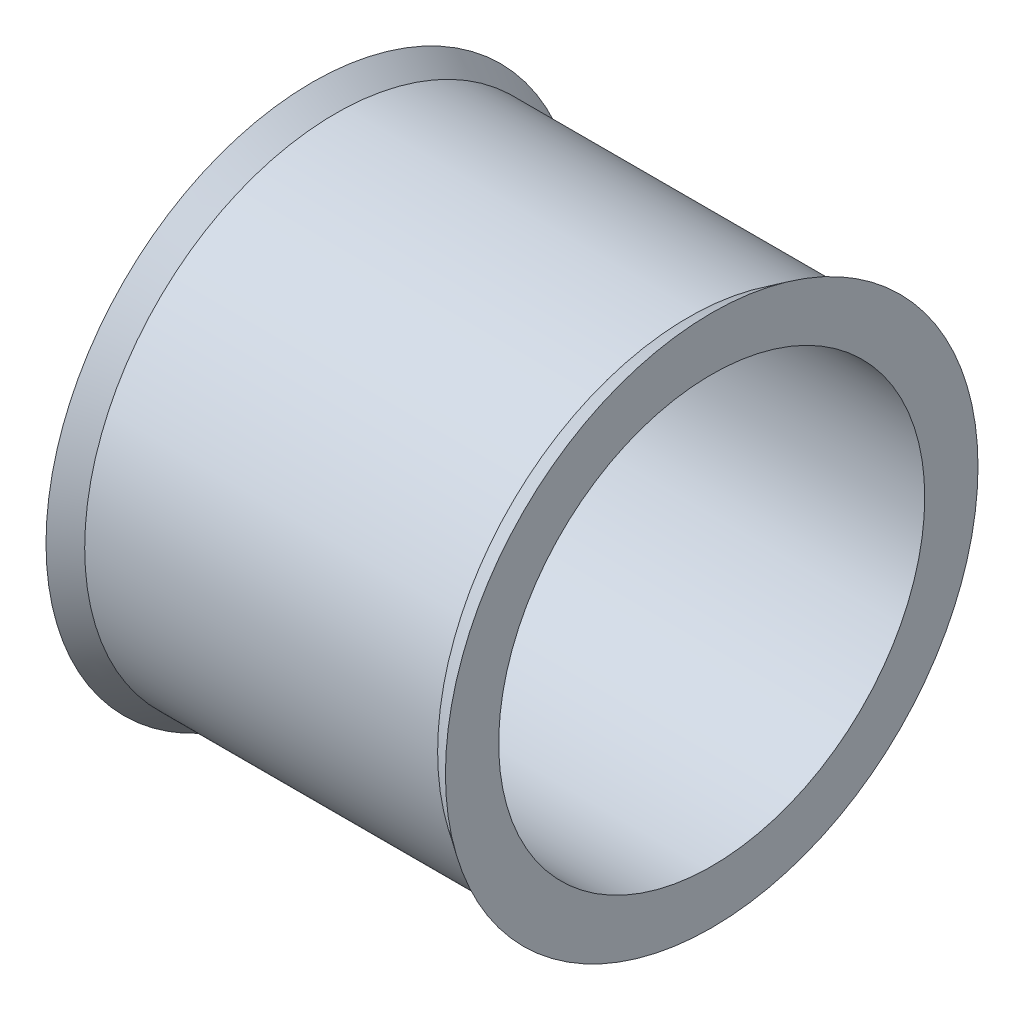
ISO-10303-21;
HEADER;
FILE_DESCRIPTION(('STEP AP214'),'2;1');
FILE_NAME('part.step','',(''),(''),'','','');
FILE_SCHEMA(('AUTOMOTIVE_DESIGN { 1 0 10303 214 1 1 1 1 }'));
ENDSEC;
DATA;
#1=APPLICATION_CONTEXT('core data for automotive mechanical design processes');
#2=APPLICATION_PROTOCOL_DEFINITION('international standard','automotive_design',2000,#1);
#3=PRODUCT_CONTEXT('',#1,'mechanical');
#4=PRODUCT('Part','Part','',(#3));
#5=PRODUCT_RELATED_PRODUCT_CATEGORY('part','',(#4));
#6=PRODUCT_DEFINITION_FORMATION('','',#4);
#7=PRODUCT_DEFINITION_CONTEXT('part definition',#1,'design');
#8=PRODUCT_DEFINITION('design','',#6,#7);
#9=PRODUCT_DEFINITION_SHAPE('','',#8);
#10=(LENGTH_UNIT() NAMED_UNIT(*) SI_UNIT(.MILLI.,.METRE.));
#11=(NAMED_UNIT(*) PLANE_ANGLE_UNIT() SI_UNIT($,.RADIAN.));
#12=(NAMED_UNIT(*) SI_UNIT($,.STERADIAN.) SOLID_ANGLE_UNIT());
#13=UNCERTAINTY_MEASURE_WITH_UNIT(LENGTH_MEASURE(1.E-05),#10,'distance_accuracy_value','');
#14=(GEOMETRIC_REPRESENTATION_CONTEXT(3) GLOBAL_UNCERTAINTY_ASSIGNED_CONTEXT((#13)) GLOBAL_UNIT_ASSIGNED_CONTEXT((#10,
#11,#12)) REPRESENTATION_CONTEXT('',''));
#15=CARTESIAN_POINT('',(0.,0.,0.));
#16=DIRECTION('',(0.,0.,1.));
#17=DIRECTION('',(1.,0.,0.));
#18=AXIS2_PLACEMENT_3D('',#15,#16,#17);
#19=CARTESIAN_POINT('',(-7.39832129826774,100.,0.));
#20=DIRECTION('',(1.,0.,0.));
#21=DIRECTION('',(0.,0.,-1.));
#22=AXIS2_PLACEMENT_3D('',#19,#20,#21);
#23=PLANE('',#22);
#24=CARTESIAN_POINT('',(-7.39832129826774,0.,0.));
#25=DIRECTION('',(1.,0.,0.));
#26=DIRECTION('',(0.,0.,-1.));
#27=AXIS2_PLACEMENT_3D('',#24,#25,#26);
#28=CIRCLE('',#27,100.);
#29=CARTESIAN_POINT('',(-7.39832129826774,0.,-100.));
#30=VERTEX_POINT('',#29);
#31=EDGE_CURVE('E55',#30,#30,#28,.T.);
#32=ORIENTED_EDGE('',*,*,#31,.T.);
#33=EDGE_LOOP('',(#32));
#34=FACE_BOUND('',#33,.T.);
#35=CARTESIAN_POINT('',(-7.39832129826774,0.,0.));
#36=DIRECTION('',(1.,0.,0.));
#37=DIRECTION('',(0.,0.,-1.));
#38=AXIS2_PLACEMENT_3D('',#35,#36,#37);
#39=CIRCLE('',#38,80.);
#40=CARTESIAN_POINT('',(-7.39832129826774,0.,-80.));
#41=VERTEX_POINT('',#40);
#42=EDGE_CURVE('E10',#41,#41,#39,.T.);
#43=ORIENTED_EDGE('',*,*,#42,.F.);
#44=EDGE_LOOP('',(#43));
#45=FACE_BOUND('',#44,.T.);
#46=ADVANCED_FACE('F33',(#34,#45),#23,.T.);
#47=CARTESIAN_POINT('',(0.,0.,0.));
#48=DIRECTION('',(1.,0.,0.));
#49=DIRECTION('',(0.,0.,-1.));
#50=AXIS2_PLACEMENT_3D('',#47,#48,#49);
#51=CYLINDRICAL_SURFACE('',#50,80.);
#52=ORIENTED_EDGE('',*,*,#42,.T.);
#53=EDGE_LOOP('',(#52));
#54=FACE_BOUND('',#53,.T.);
#55=CARTESIAN_POINT('',(-157.398321298268,0.,0.));
#56=DIRECTION('',(1.,0.,0.));
#57=DIRECTION('',(0.,0.,-1.));
#58=AXIS2_PLACEMENT_3D('',#55,#56,#57);
#59=CIRCLE('',#58,80.);
#60=CARTESIAN_POINT('',(-157.398321298268,0.,-80.));
#61=VERTEX_POINT('',#60);
#62=EDGE_CURVE('E39',#61,#61,#59,.T.);
#63=ORIENTED_EDGE('',*,*,#62,.F.);
#64=EDGE_LOOP('',(#63));
#65=FACE_BOUND('',#64,.T.);
#66=ADVANCED_FACE('F73',(#54,#65),#51,.F.);
#67=CARTESIAN_POINT('',(-157.398321298268,80.,0.));
#68=DIRECTION('',(-1.,0.,0.));
#69=DIRECTION('',(0.,0.,1.));
#70=AXIS2_PLACEMENT_3D('',#67,#68,#69);
#71=PLANE('',#70);
#72=ORIENTED_EDGE('',*,*,#62,.T.);
#73=EDGE_LOOP('',(#72));
#74=FACE_BOUND('',#73,.T.);
#75=CARTESIAN_POINT('',(-157.398321298268,0.,0.));
#76=DIRECTION('',(1.,0.,0.));
#77=DIRECTION('',(0.,0.,-1.));
#78=AXIS2_PLACEMENT_3D('',#75,#76,#77);
#79=CIRCLE('',#78,100.);
#80=CARTESIAN_POINT('',(-157.398321298268,0.,-100.));
#81=VERTEX_POINT('',#80);
#82=EDGE_CURVE('E43',#81,#81,#79,.T.);
#83=ORIENTED_EDGE('',*,*,#82,.F.);
#84=EDGE_LOOP('',(#83));
#85=FACE_BOUND('',#84,.T.);
#86=ADVANCED_FACE('F77',(#74,#85),#71,.T.);
#87=CARTESIAN_POINT('',(-148.66968944119,0.,0.));
#88=DIRECTION('',(-1.,0.,0.));
#89=DIRECTION('',(0.,0.,1.));
#90=AXIS2_PLACEMENT_3D('',#87,#88,#89);
#91=CONICAL_SURFACE('',#90,94.1998805267814,0.586496621202305);
#92=ORIENTED_EDGE('',*,*,#82,.T.);
#93=EDGE_LOOP('',(#92));
#94=FACE_BOUND('',#93,.T.);
#95=CARTESIAN_POINT('',(-148.66968944119,0.,0.));
#96=DIRECTION('',(1.,0.,0.));
#97=DIRECTION('',(0.,0.,-1.));
#98=AXIS2_PLACEMENT_3D('',#95,#96,#97);
#99=CIRCLE('',#98,94.1998805267814);
#100=CARTESIAN_POINT('',(-148.66968944119,0.,-94.1998805267814));
#101=VERTEX_POINT('',#100);
#102=EDGE_CURVE('E47',#101,#101,#99,.T.);
#103=ORIENTED_EDGE('',*,*,#102,.F.);
#104=EDGE_LOOP('',(#103));
#105=FACE_BOUND('',#104,.T.);
#106=ADVANCED_FACE('F69',(#94,#105),#91,.T.);
#107=CARTESIAN_POINT('',(0.,0.,0.));
#108=DIRECTION('',(1.,0.,0.));
#109=DIRECTION('',(0.,0.,-1.));
#110=AXIS2_PLACEMENT_3D('',#107,#108,#109);
#111=CYLINDRICAL_SURFACE('',#110,94.1998805267814);
#112=ORIENTED_EDGE('',*,*,#102,.T.);
#113=EDGE_LOOP('',(#112));
#114=FACE_BOUND('',#113,.T.);
#115=CARTESIAN_POINT('',(-16.1269531553453,0.,0.));
#116=DIRECTION('',(1.,0.,0.));
#117=DIRECTION('',(0.,0.,-1.));
#118=AXIS2_PLACEMENT_3D('',#115,#116,#117);
#119=CIRCLE('',#118,94.1998805267813);
#120=CARTESIAN_POINT('',(-16.1269531553453,0.,-94.1998805267813));
#121=VERTEX_POINT('',#120);
#122=EDGE_CURVE('E52',#121,#121,#119,.T.);
#123=ORIENTED_EDGE('',*,*,#122,.F.);
#124=EDGE_LOOP('',(#123));
#125=FACE_BOUND('',#124,.T.);
#126=ADVANCED_FACE('F63',(#114,#125),#111,.T.);
#127=CARTESIAN_POINT('',(-7.39832129826774,0.,0.));
#128=DIRECTION('',(1.,0.,0.));
#129=DIRECTION('',(0.,0.,-1.));
#130=AXIS2_PLACEMENT_3D('',#127,#128,#129);
#131=CONICAL_SURFACE('',#130,100.,0.586496621202311);
#132=ORIENTED_EDGE('',*,*,#122,.T.);
#133=EDGE_LOOP('',(#132));
#134=FACE_BOUND('',#133,.T.);
#135=ORIENTED_EDGE('',*,*,#31,.F.);
#136=EDGE_LOOP('',(#135));
#137=FACE_BOUND('',#136,.T.);
#138=ADVANCED_FACE('F61',(#134,#137),#131,.T.);
#139=CLOSED_SHELL('',(#46,#66,#86,#106,#126,#138));
#140=MANIFOLD_SOLID_BREP('B2',#139);
#141=ADVANCED_BREP_SHAPE_REPRESENTATION('',(#18,#140),#14);
#142=SHAPE_DEFINITION_REPRESENTATION(#9,#141);
ENDSEC;
END-ISO-10303-21;
